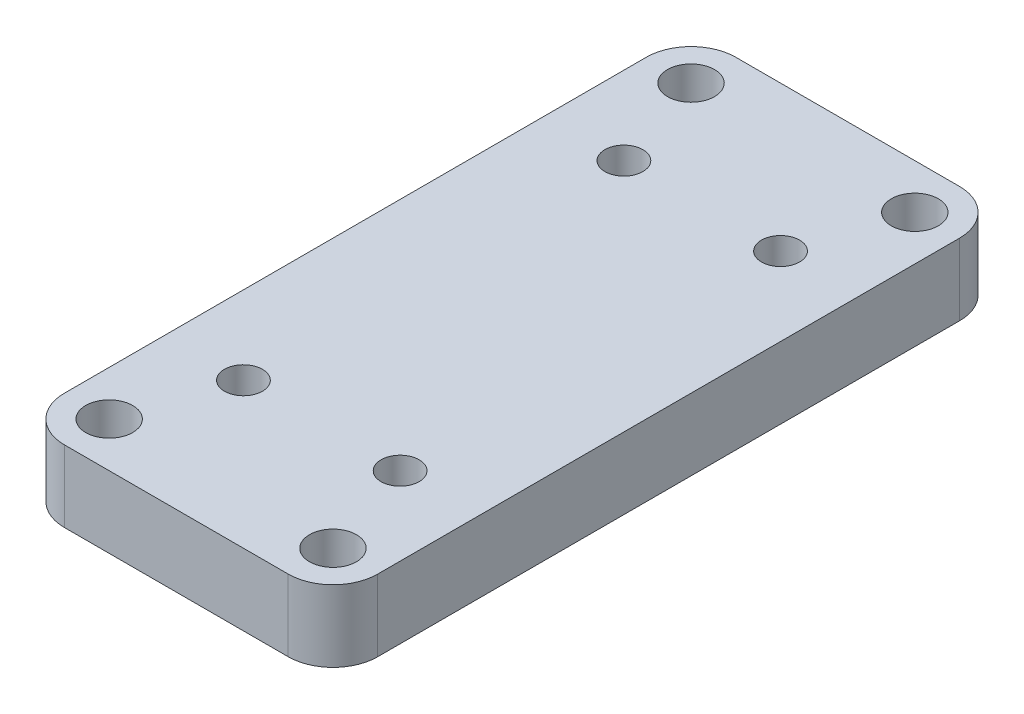
ISO-10303-21;
HEADER;
FILE_DESCRIPTION(('STEP AP214'),'2;1');
FILE_NAME('part.step','',(''),(''),'','','');
FILE_SCHEMA(('AUTOMOTIVE_DESIGN { 1 0 10303 214 1 1 1 1 }'));
ENDSEC;
DATA;
#1=APPLICATION_CONTEXT('core data for automotive mechanical design processes');
#2=APPLICATION_PROTOCOL_DEFINITION('international standard','automotive_design',2000,#1);
#3=PRODUCT_CONTEXT('',#1,'mechanical');
#4=PRODUCT('Part','Part','',(#3));
#5=PRODUCT_RELATED_PRODUCT_CATEGORY('part','',(#4));
#6=PRODUCT_DEFINITION_FORMATION('','',#4);
#7=PRODUCT_DEFINITION_CONTEXT('part definition',#1,'design');
#8=PRODUCT_DEFINITION('design','',#6,#7);
#9=PRODUCT_DEFINITION_SHAPE('','',#8);
#10=(LENGTH_UNIT() NAMED_UNIT(*) SI_UNIT(.MILLI.,.METRE.));
#11=(NAMED_UNIT(*) PLANE_ANGLE_UNIT() SI_UNIT($,.RADIAN.));
#12=(NAMED_UNIT(*) SI_UNIT($,.STERADIAN.) SOLID_ANGLE_UNIT());
#13=UNCERTAINTY_MEASURE_WITH_UNIT(LENGTH_MEASURE(1.E-05),#10,'distance_accuracy_value','');
#14=(GEOMETRIC_REPRESENTATION_CONTEXT(3) GLOBAL_UNCERTAINTY_ASSIGNED_CONTEXT((#13)) GLOBAL_UNIT_ASSIGNED_CONTEXT((#10,
#11,#12)) REPRESENTATION_CONTEXT('',''));
#15=CARTESIAN_POINT('',(0.,0.,0.));
#16=DIRECTION('',(0.,0.,1.));
#17=DIRECTION('',(1.,0.,0.));
#18=AXIS2_PLACEMENT_3D('',#15,#16,#17);
#19=CARTESIAN_POINT('',(-35.,0.,75.));
#20=DIRECTION('',(0.,1.,0.));
#21=DIRECTION('',(1.,0.,0.));
#22=AXIS2_PLACEMENT_3D('',#19,#20,#21);
#23=PLANE('',#22);
#24=CARTESIAN_POINT('',(-52.5,0.,117.5));
#25=DIRECTION('',(0.,1.,0.));
#26=DIRECTION('',(1.,0.,0.));
#27=AXIS2_PLACEMENT_3D('',#24,#25,#26);
#28=CIRCLE('',#27,4.25);
#29=CARTESIAN_POINT('',(-56.75,0.,117.5));
#30=VERTEX_POINT('',#29);
#31=EDGE_CURVE('E189',#30,#30,#28,.T.);
#32=ORIENTED_EDGE('',*,*,#31,.T.);
#33=EDGE_LOOP('',(#32));
#34=FACE_BOUND('',#33,.T.);
#35=CARTESIAN_POINT('',(-52.5,0.,32.5));
#36=DIRECTION('',(0.,1.,0.));
#37=DIRECTION('',(1.,0.,0.));
#38=AXIS2_PLACEMENT_3D('',#35,#36,#37);
#39=CIRCLE('',#38,4.25);
#40=CARTESIAN_POINT('',(-56.75,0.,32.5));
#41=VERTEX_POINT('',#40);
#42=EDGE_CURVE('E229',#41,#41,#39,.T.);
#43=ORIENTED_EDGE('',*,*,#42,.T.);
#44=EDGE_LOOP('',(#43));
#45=FACE_BOUND('',#44,.T.);
#46=CARTESIAN_POINT('',(-17.5,0.,32.5));
#47=DIRECTION('',(0.,1.,0.));
#48=DIRECTION('',(1.,0.,0.));
#49=AXIS2_PLACEMENT_3D('',#46,#47,#48);
#50=CIRCLE('',#49,4.25);
#51=CARTESIAN_POINT('',(-21.75,0.,32.5));
#52=VERTEX_POINT('',#51);
#53=EDGE_CURVE('E213',#52,#52,#50,.T.);
#54=ORIENTED_EDGE('',*,*,#53,.T.);
#55=EDGE_LOOP('',(#54));
#56=FACE_BOUND('',#55,.T.);
#57=CARTESIAN_POINT('',(-17.5,0.,117.5));
#58=DIRECTION('',(0.,1.,0.));
#59=DIRECTION('',(1.,0.,0.));
#60=AXIS2_PLACEMENT_3D('',#57,#58,#59);
#61=CIRCLE('',#60,4.25);
#62=CARTESIAN_POINT('',(-21.75,0.,117.5));
#63=VERTEX_POINT('',#62);
#64=EDGE_CURVE('E214',#63,#63,#61,.T.);
#65=ORIENTED_EDGE('',*,*,#64,.T.);
#66=EDGE_LOOP('',(#65));
#67=FACE_BOUND('',#66,.T.);
#68=CARTESIAN_POINT('',(-10.,0.,140.));
#69=DIRECTION('',(0.,1.,0.));
#70=DIRECTION('',(1.,0.,0.));
#71=AXIS2_PLACEMENT_3D('',#68,#69,#70);
#72=CIRCLE('',#71,5.25);
#73=CARTESIAN_POINT('',(-15.25,0.,140.));
#74=VERTEX_POINT('',#73);
#75=EDGE_CURVE('E218',#74,#74,#72,.T.);
#76=ORIENTED_EDGE('',*,*,#75,.T.);
#77=EDGE_LOOP('',(#76));
#78=FACE_BOUND('',#77,.T.);
#79=CARTESIAN_POINT('',(-10.,0.,10.));
#80=DIRECTION('',(0.,1.,0.));
#81=DIRECTION('',(1.,0.,0.));
#82=AXIS2_PLACEMENT_3D('',#79,#80,#81);
#83=CIRCLE('',#82,5.25);
#84=CARTESIAN_POINT('',(-15.25,0.,10.));
#85=VERTEX_POINT('',#84);
#86=EDGE_CURVE('E20',#85,#85,#83,.T.);
#87=ORIENTED_EDGE('',*,*,#86,.T.);
#88=EDGE_LOOP('',(#87));
#89=FACE_BOUND('',#88,.T.);
#90=CARTESIAN_POINT('',(-60.,0.,10.));
#91=DIRECTION('',(0.,1.,0.));
#92=DIRECTION('',(1.,0.,0.));
#93=AXIS2_PLACEMENT_3D('',#90,#91,#92);
#94=CIRCLE('',#93,5.25);
#95=CARTESIAN_POINT('',(-65.25,0.,10.));
#96=VERTEX_POINT('',#95);
#97=EDGE_CURVE('E162',#96,#96,#94,.T.);
#98=ORIENTED_EDGE('',*,*,#97,.T.);
#99=EDGE_LOOP('',(#98));
#100=FACE_BOUND('',#99,.T.);
#101=CARTESIAN_POINT('',(-60.,0.,140.));
#102=DIRECTION('',(0.,1.,0.));
#103=DIRECTION('',(1.,0.,0.));
#104=AXIS2_PLACEMENT_3D('',#101,#102,#103);
#105=CIRCLE('',#104,5.25);
#106=CARTESIAN_POINT('',(-65.25,0.,140.));
#107=VERTEX_POINT('',#106);
#108=EDGE_CURVE('E158',#107,#107,#105,.T.);
#109=ORIENTED_EDGE('',*,*,#108,.T.);
#110=EDGE_LOOP('',(#109));
#111=FACE_BOUND('',#110,.T.);
#112=CARTESIAN_POINT('',(-10.,0.,140.));
#113=DIRECTION('',(0.,1.,0.));
#114=DIRECTION('',(0.707106781186548,0.,0.707106781186547));
#115=AXIS2_PLACEMENT_3D('',#112,#113,#114);
#116=CIRCLE('',#115,10.);
#117=CARTESIAN_POINT('',(-10.,0.,150.));
#118=VERTEX_POINT('',#117);
#119=CARTESIAN_POINT('',(0.,0.,140.));
#120=VERTEX_POINT('',#119);
#121=EDGE_CURVE('E197',#118,#120,#116,.T.);
#122=ORIENTED_EDGE('',*,*,#121,.F.);
#123=DIRECTION('',(1.,0.,0.));
#124=VECTOR('',#123,1.);
#125=CARTESIAN_POINT('',(-70.,0.,150.));
#126=LINE('',#125,#124);
#127=CARTESIAN_POINT('',(-60.,0.,150.));
#128=VERTEX_POINT('',#127);
#129=EDGE_CURVE('E267',#128,#118,#126,.T.);
#130=ORIENTED_EDGE('',*,*,#129,.F.);
#131=CARTESIAN_POINT('',(-60.,0.,140.));
#132=DIRECTION('',(0.,1.,0.));
#133=DIRECTION('',(-0.707106781186548,0.,0.707106781186548));
#134=AXIS2_PLACEMENT_3D('',#131,#132,#133);
#135=CIRCLE('',#134,10.);
#136=CARTESIAN_POINT('',(-70.,0.,140.));
#137=VERTEX_POINT('',#136);
#138=EDGE_CURVE('E253',#137,#128,#135,.T.);
#139=ORIENTED_EDGE('',*,*,#138,.F.);
#140=DIRECTION('',(0.,0.,1.));
#141=VECTOR('',#140,1.);
#142=CARTESIAN_POINT('',(-70.,0.,0.));
#143=LINE('',#142,#141);
#144=CARTESIAN_POINT('',(-70.,0.,10.));
#145=VERTEX_POINT('',#144);
#146=EDGE_CURVE('E252',#145,#137,#143,.T.);
#147=ORIENTED_EDGE('',*,*,#146,.F.);
#148=CARTESIAN_POINT('',(-60.,0.,10.));
#149=DIRECTION('',(0.,1.,0.));
#150=DIRECTION('',(-0.707106781186548,0.,-0.707106781186548));
#151=AXIS2_PLACEMENT_3D('',#148,#149,#150);
#152=CIRCLE('',#151,10.);
#153=CARTESIAN_POINT('',(-60.,0.,0.));
#154=VERTEX_POINT('',#153);
#155=EDGE_CURVE('E257',#154,#145,#152,.T.);
#156=ORIENTED_EDGE('',*,*,#155,.F.);
#157=DIRECTION('',(-1.,0.,0.));
#158=VECTOR('',#157,1.);
#159=CARTESIAN_POINT('',(0.,0.,0.));
#160=LINE('',#159,#158);
#161=CARTESIAN_POINT('',(-10.,0.,0.));
#162=VERTEX_POINT('',#161);
#163=EDGE_CURVE('E188',#162,#154,#160,.T.);
#164=ORIENTED_EDGE('',*,*,#163,.F.);
#165=CARTESIAN_POINT('',(-10.,0.,10.));
#166=DIRECTION('',(0.,1.,0.));
#167=DIRECTION('',(0.707106781186547,0.,-0.707106781186548));
#168=AXIS2_PLACEMENT_3D('',#165,#166,#167);
#169=CIRCLE('',#168,10.);
#170=CARTESIAN_POINT('',(0.,0.,10.));
#171=VERTEX_POINT('',#170);
#172=EDGE_CURVE('E167',#171,#162,#169,.T.);
#173=ORIENTED_EDGE('',*,*,#172,.F.);
#174=DIRECTION('',(0.,0.,-1.));
#175=VECTOR('',#174,1.);
#176=CARTESIAN_POINT('',(0.,0.,150.));
#177=LINE('',#176,#175);
#178=EDGE_CURVE('E11',#120,#171,#177,.T.);
#179=ORIENTED_EDGE('',*,*,#178,.F.);
#180=EDGE_LOOP('',(#122,#130,#139,#147,#156,#164,#173,#179));
#181=FACE_BOUND('',#180,.T.);
#182=ADVANCED_FACE('F17',(#34,#45,#56,#67,#78,#89,#100,#111,#181),#23,.F.);
#183=CARTESIAN_POINT('',(0.,0.,150.));
#184=DIRECTION('',(1.,0.,0.));
#185=DIRECTION('',(0.,0.,-1.));
#186=AXIS2_PLACEMENT_3D('',#183,#184,#185);
#187=PLANE('',#186);
#188=DIRECTION('',(0.,1.,0.));
#189=VECTOR('',#188,1.);
#190=CARTESIAN_POINT('',(0.,0.,140.));
#191=LINE('',#190,#189);
#192=CARTESIAN_POINT('',(0.,16.,140.));
#193=VERTEX_POINT('',#192);
#194=EDGE_CURVE('E243',#120,#193,#191,.T.);
#195=ORIENTED_EDGE('',*,*,#194,.F.);
#196=ORIENTED_EDGE('',*,*,#178,.T.);
#197=DIRECTION('',(0.,-1.,0.));
#198=VECTOR('',#197,1.);
#199=CARTESIAN_POINT('',(0.,0.,10.));
#200=LINE('',#199,#198);
#201=CARTESIAN_POINT('',(0.,16.,10.));
#202=VERTEX_POINT('',#201);
#203=EDGE_CURVE('E173',#202,#171,#200,.T.);
#204=ORIENTED_EDGE('',*,*,#203,.F.);
#205=DIRECTION('',(0.,0.,-1.));
#206=VECTOR('',#205,1.);
#207=CARTESIAN_POINT('',(0.,16.,150.));
#208=LINE('',#207,#206);
#209=EDGE_CURVE('E262',#193,#202,#208,.T.);
#210=ORIENTED_EDGE('',*,*,#209,.F.);
#211=EDGE_LOOP('',(#195,#196,#204,#210));
#212=FACE_BOUND('',#211,.T.);
#213=ADVANCED_FACE('F356',(#212),#187,.T.);
#214=CARTESIAN_POINT('',(-52.5,0.,117.5));
#215=DIRECTION('',(0.,1.,0.));
#216=DIRECTION('',(1.,0.,0.));
#217=AXIS2_PLACEMENT_3D('',#214,#215,#216);
#218=CYLINDRICAL_SURFACE('',#217,4.25);
#219=ORIENTED_EDGE('',*,*,#31,.F.);
#220=DIRECTION('',(0.,1.,0.));
#221=VECTOR('',#220,1.);
#222=CARTESIAN_POINT('',(-56.75,0.,117.5));
#223=LINE('',#222,#221);
#224=CARTESIAN_POINT('',(-56.75,16.,117.5));
#225=VERTEX_POINT('',#224);
#226=EDGE_CURVE('E27',#30,#225,#223,.T.);
#227=ORIENTED_EDGE('',*,*,#226,.T.);
#228=CARTESIAN_POINT('',(-52.5,16.,117.5));
#229=DIRECTION('',(0.,-1.,0.));
#230=DIRECTION('',(1.,0.,0.));
#231=AXIS2_PLACEMENT_3D('',#228,#229,#230);
#232=CIRCLE('',#231,4.25);
#233=EDGE_CURVE('E207',#225,#225,#232,.T.);
#234=ORIENTED_EDGE('',*,*,#233,.F.);
#235=ORIENTED_EDGE('',*,*,#226,.F.);
#236=EDGE_LOOP('',(#219,#227,#234,#235));
#237=FACE_BOUND('',#236,.T.);
#238=ADVANCED_FACE('F385',(#237),#218,.F.);
#239=CARTESIAN_POINT('',(-52.5,0.,32.5));
#240=DIRECTION('',(0.,1.,0.));
#241=DIRECTION('',(1.,0.,0.));
#242=AXIS2_PLACEMENT_3D('',#239,#240,#241);
#243=CYLINDRICAL_SURFACE('',#242,4.25);
#244=ORIENTED_EDGE('',*,*,#42,.F.);
#245=DIRECTION('',(0.,1.,0.));
#246=VECTOR('',#245,1.);
#247=CARTESIAN_POINT('',(-56.75,0.,32.5));
#248=LINE('',#247,#246);
#249=CARTESIAN_POINT('',(-56.75,16.,32.5));
#250=VERTEX_POINT('',#249);
#251=EDGE_CURVE('E192',#41,#250,#248,.T.);
#252=ORIENTED_EDGE('',*,*,#251,.T.);
#253=CARTESIAN_POINT('',(-52.5,16.,32.5));
#254=DIRECTION('',(0.,-1.,0.));
#255=DIRECTION('',(1.,0.,0.));
#256=AXIS2_PLACEMENT_3D('',#253,#254,#255);
#257=CIRCLE('',#256,4.25);
#258=EDGE_CURVE('E203',#250,#250,#257,.T.);
#259=ORIENTED_EDGE('',*,*,#258,.F.);
#260=ORIENTED_EDGE('',*,*,#251,.F.);
#261=EDGE_LOOP('',(#244,#252,#259,#260));
#262=FACE_BOUND('',#261,.T.);
#263=ADVANCED_FACE('F684',(#262),#243,.F.);
#264=CARTESIAN_POINT('',(-17.5,0.,32.5));
#265=DIRECTION('',(0.,1.,0.));
#266=DIRECTION('',(1.,0.,0.));
#267=AXIS2_PLACEMENT_3D('',#264,#265,#266);
#268=CYLINDRICAL_SURFACE('',#267,4.25);
#269=ORIENTED_EDGE('',*,*,#53,.F.);
#270=DIRECTION('',(0.,1.,0.));
#271=VECTOR('',#270,1.);
#272=CARTESIAN_POINT('',(-21.75,0.,32.5));
#273=LINE('',#272,#271);
#274=CARTESIAN_POINT('',(-21.75,16.,32.5));
#275=VERTEX_POINT('',#274);
#276=EDGE_CURVE('E233',#52,#275,#273,.T.);
#277=ORIENTED_EDGE('',*,*,#276,.T.);
#278=CARTESIAN_POINT('',(-17.5,16.,32.5));
#279=DIRECTION('',(0.,-1.,0.));
#280=DIRECTION('',(1.,0.,0.));
#281=AXIS2_PLACEMENT_3D('',#278,#279,#280);
#282=CIRCLE('',#281,4.25);
#283=EDGE_CURVE('E208',#275,#275,#282,.T.);
#284=ORIENTED_EDGE('',*,*,#283,.F.);
#285=ORIENTED_EDGE('',*,*,#276,.F.);
#286=EDGE_LOOP('',(#269,#277,#284,#285));
#287=FACE_BOUND('',#286,.T.);
#288=ADVANCED_FACE('F422',(#287),#268,.F.);
#289=CARTESIAN_POINT('',(-17.5,0.,117.5));
#290=DIRECTION('',(0.,1.,0.));
#291=DIRECTION('',(1.,0.,0.));
#292=AXIS2_PLACEMENT_3D('',#289,#290,#291);
#293=CYLINDRICAL_SURFACE('',#292,4.25);
#294=ORIENTED_EDGE('',*,*,#64,.F.);
#295=DIRECTION('',(0.,1.,0.));
#296=VECTOR('',#295,1.);
#297=CARTESIAN_POINT('',(-21.75,0.,117.5));
#298=LINE('',#297,#296);
#299=CARTESIAN_POINT('',(-21.75,16.,117.5));
#300=VERTEX_POINT('',#299);
#301=EDGE_CURVE('E209',#63,#300,#298,.T.);
#302=ORIENTED_EDGE('',*,*,#301,.T.);
#303=CARTESIAN_POINT('',(-17.5,16.,117.5));
#304=DIRECTION('',(0.,-1.,0.));
#305=DIRECTION('',(1.,0.,0.));
#306=AXIS2_PLACEMENT_3D('',#303,#304,#305);
#307=CIRCLE('',#306,4.25);
#308=EDGE_CURVE('E237',#300,#300,#307,.T.);
#309=ORIENTED_EDGE('',*,*,#308,.F.);
#310=ORIENTED_EDGE('',*,*,#301,.F.);
#311=EDGE_LOOP('',(#294,#302,#309,#310));
#312=FACE_BOUND('',#311,.T.);
#313=ADVANCED_FACE('F417',(#312),#293,.F.);
#314=CARTESIAN_POINT('',(-10.,0.,140.));
#315=DIRECTION('',(0.,1.,0.));
#316=DIRECTION('',(1.,0.,0.));
#317=AXIS2_PLACEMENT_3D('',#314,#315,#316);
#318=CYLINDRICAL_SURFACE('',#317,5.25);
#319=ORIENTED_EDGE('',*,*,#75,.F.);
#320=DIRECTION('',(0.,1.,0.));
#321=VECTOR('',#320,1.);
#322=CARTESIAN_POINT('',(-15.25,0.,140.));
#323=LINE('',#322,#321);
#324=CARTESIAN_POINT('',(-15.25,16.,140.));
#325=VERTEX_POINT('',#324);
#326=EDGE_CURVE('E215',#74,#325,#323,.T.);
#327=ORIENTED_EDGE('',*,*,#326,.T.);
#328=CARTESIAN_POINT('',(-10.,16.,140.));
#329=DIRECTION('',(0.,-1.,0.));
#330=DIRECTION('',(1.,0.,0.));
#331=AXIS2_PLACEMENT_3D('',#328,#329,#330);
#332=CIRCLE('',#331,5.25);
#333=EDGE_CURVE('E202',#325,#325,#332,.T.);
#334=ORIENTED_EDGE('',*,*,#333,.F.);
#335=ORIENTED_EDGE('',*,*,#326,.F.);
#336=EDGE_LOOP('',(#319,#327,#334,#335));
#337=FACE_BOUND('',#336,.T.);
#338=ADVANCED_FACE('F411',(#337),#318,.F.);
#339=CARTESIAN_POINT('',(-10.,0.,10.));
#340=DIRECTION('',(0.,1.,0.));
#341=DIRECTION('',(1.,0.,0.));
#342=AXIS2_PLACEMENT_3D('',#339,#340,#341);
#343=CYLINDRICAL_SURFACE('',#342,5.25);
#344=ORIENTED_EDGE('',*,*,#86,.F.);
#345=DIRECTION('',(0.,1.,0.));
#346=VECTOR('',#345,1.);
#347=CARTESIAN_POINT('',(-15.25,0.,10.));
#348=LINE('',#347,#346);
#349=CARTESIAN_POINT('',(-15.25,16.,10.));
#350=VERTEX_POINT('',#349);
#351=EDGE_CURVE('E300',#85,#350,#348,.T.);
#352=ORIENTED_EDGE('',*,*,#351,.T.);
#353=CARTESIAN_POINT('',(-10.,16.,10.));
#354=DIRECTION('',(0.,-1.,0.));
#355=DIRECTION('',(1.,0.,0.));
#356=AXIS2_PLACEMENT_3D('',#353,#354,#355);
#357=CIRCLE('',#356,5.25);
#358=EDGE_CURVE('E181',#350,#350,#357,.T.);
#359=ORIENTED_EDGE('',*,*,#358,.F.);
#360=ORIENTED_EDGE('',*,*,#351,.F.);
#361=EDGE_LOOP('',(#344,#352,#359,#360));
#362=FACE_BOUND('',#361,.T.);
#363=ADVANCED_FACE('F405',(#362),#343,.F.);
#364=CARTESIAN_POINT('',(-60.,0.,10.));
#365=DIRECTION('',(0.,1.,0.));
#366=DIRECTION('',(1.,0.,0.));
#367=AXIS2_PLACEMENT_3D('',#364,#365,#366);
#368=CYLINDRICAL_SURFACE('',#367,5.25);
#369=ORIENTED_EDGE('',*,*,#97,.F.);
#370=DIRECTION('',(0.,1.,0.));
#371=VECTOR('',#370,1.);
#372=CARTESIAN_POINT('',(-65.25,0.,10.));
#373=LINE('',#372,#371);
#374=CARTESIAN_POINT('',(-65.25,16.,10.));
#375=VERTEX_POINT('',#374);
#376=EDGE_CURVE('E182',#96,#375,#373,.T.);
#377=ORIENTED_EDGE('',*,*,#376,.T.);
#378=CARTESIAN_POINT('',(-60.,16.,10.));
#379=DIRECTION('',(0.,-1.,0.));
#380=DIRECTION('',(1.,0.,0.));
#381=AXIS2_PLACEMENT_3D('',#378,#379,#380);
#382=CIRCLE('',#381,5.25);
#383=EDGE_CURVE('E177',#375,#375,#382,.T.);
#384=ORIENTED_EDGE('',*,*,#383,.F.);
#385=ORIENTED_EDGE('',*,*,#376,.F.);
#386=EDGE_LOOP('',(#369,#377,#384,#385));
#387=FACE_BOUND('',#386,.T.);
#388=ADVANCED_FACE('F400',(#387),#368,.F.);
#389=CARTESIAN_POINT('',(-60.,0.,140.));
#390=DIRECTION('',(0.,1.,0.));
#391=DIRECTION('',(1.,0.,0.));
#392=AXIS2_PLACEMENT_3D('',#389,#390,#391);
#393=CYLINDRICAL_SURFACE('',#392,5.25);
#394=ORIENTED_EDGE('',*,*,#108,.F.);
#395=DIRECTION('',(0.,1.,0.));
#396=VECTOR('',#395,1.);
#397=CARTESIAN_POINT('',(-65.25,0.,140.));
#398=LINE('',#397,#396);
#399=CARTESIAN_POINT('',(-65.25,16.,140.));
#400=VERTEX_POINT('',#399);
#401=EDGE_CURVE('E155',#107,#400,#398,.T.);
#402=ORIENTED_EDGE('',*,*,#401,.T.);
#403=CARTESIAN_POINT('',(-60.,16.,140.));
#404=DIRECTION('',(0.,-1.,0.));
#405=DIRECTION('',(1.,0.,0.));
#406=AXIS2_PLACEMENT_3D('',#403,#404,#405);
#407=CIRCLE('',#406,5.25);
#408=EDGE_CURVE('E160',#400,#400,#407,.T.);
#409=ORIENTED_EDGE('',*,*,#408,.F.);
#410=ORIENTED_EDGE('',*,*,#401,.F.);
#411=EDGE_LOOP('',(#394,#402,#409,#410));
#412=FACE_BOUND('',#411,.T.);
#413=ADVANCED_FACE('F157',(#412),#393,.F.);
#414=CARTESIAN_POINT('',(-10.,0.,10.));
#415=DIRECTION('',(0.,1.,0.));
#416=DIRECTION('',(0.707106781186547,0.,-0.707106781186548));
#417=AXIS2_PLACEMENT_3D('',#414,#415,#416);
#418=CYLINDRICAL_SURFACE('',#417,10.);
#419=CARTESIAN_POINT('',(-10.,16.,10.));
#420=DIRECTION('',(0.,-1.,0.));
#421=DIRECTION('',(0.707106781186547,0.,-0.707106781186548));
#422=AXIS2_PLACEMENT_3D('',#419,#420,#421);
#423=CIRCLE('',#422,10.);
#424=CARTESIAN_POINT('',(-10.,16.,0.));
#425=VERTEX_POINT('',#424);
#426=EDGE_CURVE('E266',#425,#202,#423,.T.);
#427=ORIENTED_EDGE('',*,*,#426,.T.);
#428=ORIENTED_EDGE('',*,*,#203,.T.);
#429=ORIENTED_EDGE('',*,*,#172,.T.);
#430=DIRECTION('',(0.,1.,0.));
#431=VECTOR('',#430,1.);
#432=CARTESIAN_POINT('',(-10.,0.,0.));
#433=LINE('',#432,#431);
#434=EDGE_CURVE('E260',#162,#425,#433,.T.);
#435=ORIENTED_EDGE('',*,*,#434,.T.);
#436=EDGE_LOOP('',(#427,#428,#429,#435));
#437=FACE_BOUND('',#436,.T.);
#438=ADVANCED_FACE('F357',(#437),#418,.T.);
#439=CARTESIAN_POINT('',(0.,0.,0.));
#440=DIRECTION('',(0.,0.,-1.));
#441=DIRECTION('',(-1.,0.,0.));
#442=AXIS2_PLACEMENT_3D('',#439,#440,#441);
#443=PLANE('',#442);
#444=DIRECTION('',(0.,-1.,0.));
#445=VECTOR('',#444,1.);
#446=CARTESIAN_POINT('',(-60.,0.,0.));
#447=LINE('',#446,#445);
#448=CARTESIAN_POINT('',(-60.,16.,0.));
#449=VERTEX_POINT('',#448);
#450=EDGE_CURVE('E261',#449,#154,#447,.T.);
#451=ORIENTED_EDGE('',*,*,#450,.F.);
#452=DIRECTION('',(-1.,0.,0.));
#453=VECTOR('',#452,1.);
#454=CARTESIAN_POINT('',(0.,16.,0.));
#455=LINE('',#454,#453);
#456=EDGE_CURVE('E224',#425,#449,#455,.T.);
#457=ORIENTED_EDGE('',*,*,#456,.F.);
#458=ORIENTED_EDGE('',*,*,#434,.F.);
#459=ORIENTED_EDGE('',*,*,#163,.T.);
#460=EDGE_LOOP('',(#451,#457,#458,#459));
#461=FACE_BOUND('',#460,.T.);
#462=ADVANCED_FACE('F359',(#461),#443,.T.);
#463=CARTESIAN_POINT('',(-60.,0.,10.));
#464=DIRECTION('',(0.,1.,0.));
#465=DIRECTION('',(-0.707106781186548,0.,-0.707106781186548));
#466=AXIS2_PLACEMENT_3D('',#463,#464,#465);
#467=CYLINDRICAL_SURFACE('',#466,10.);
#468=CARTESIAN_POINT('',(-60.,16.,10.));
#469=DIRECTION('',(0.,-1.,0.));
#470=DIRECTION('',(-0.707106781186548,0.,-0.707106781186548));
#471=AXIS2_PLACEMENT_3D('',#468,#469,#470);
#472=CIRCLE('',#471,10.);
#473=CARTESIAN_POINT('',(-70.,16.,10.));
#474=VERTEX_POINT('',#473);
#475=EDGE_CURVE('E219',#474,#449,#472,.T.);
#476=ORIENTED_EDGE('',*,*,#475,.T.);
#477=ORIENTED_EDGE('',*,*,#450,.T.);
#478=ORIENTED_EDGE('',*,*,#155,.T.);
#479=DIRECTION('',(0.,1.,0.));
#480=VECTOR('',#479,1.);
#481=CARTESIAN_POINT('',(-70.,0.,10.));
#482=LINE('',#481,#480);
#483=EDGE_CURVE('E249',#145,#474,#482,.T.);
#484=ORIENTED_EDGE('',*,*,#483,.T.);
#485=EDGE_LOOP('',(#476,#477,#478,#484));
#486=FACE_BOUND('',#485,.T.);
#487=ADVANCED_FACE('F361',(#486),#467,.T.);
#488=CARTESIAN_POINT('',(-70.,0.,0.));
#489=DIRECTION('',(-1.,0.,0.));
#490=DIRECTION('',(0.,0.,1.));
#491=AXIS2_PLACEMENT_3D('',#488,#489,#490);
#492=PLANE('',#491);
#493=DIRECTION('',(0.,-1.,0.));
#494=VECTOR('',#493,1.);
#495=CARTESIAN_POINT('',(-70.,0.,140.));
#496=LINE('',#495,#494);
#497=CARTESIAN_POINT('',(-70.,16.,140.));
#498=VERTEX_POINT('',#497);
#499=EDGE_CURVE('E228',#498,#137,#496,.T.);
#500=ORIENTED_EDGE('',*,*,#499,.F.);
#501=DIRECTION('',(0.,0.,1.));
#502=VECTOR('',#501,1.);
#503=CARTESIAN_POINT('',(-70.,16.,0.));
#504=LINE('',#503,#502);
#505=EDGE_CURVE('E223',#474,#498,#504,.T.);
#506=ORIENTED_EDGE('',*,*,#505,.F.);
#507=ORIENTED_EDGE('',*,*,#483,.F.);
#508=ORIENTED_EDGE('',*,*,#146,.T.);
#509=EDGE_LOOP('',(#500,#506,#507,#508));
#510=FACE_BOUND('',#509,.T.);
#511=ADVANCED_FACE('F366',(#510),#492,.T.);
#512=CARTESIAN_POINT('',(-60.,0.,140.));
#513=DIRECTION('',(0.,1.,0.));
#514=DIRECTION('',(-0.707106781186548,0.,0.707106781186548));
#515=AXIS2_PLACEMENT_3D('',#512,#513,#514);
#516=CYLINDRICAL_SURFACE('',#515,10.);
#517=CARTESIAN_POINT('',(-60.,16.,140.));
#518=DIRECTION('',(0.,-1.,0.));
#519=DIRECTION('',(-0.707106781186548,0.,0.707106781186548));
#520=AXIS2_PLACEMENT_3D('',#517,#518,#519);
#521=CIRCLE('',#520,10.);
#522=CARTESIAN_POINT('',(-60.,16.,150.));
#523=VERTEX_POINT('',#522);
#524=EDGE_CURVE('E248',#523,#498,#521,.T.);
#525=ORIENTED_EDGE('',*,*,#524,.T.);
#526=ORIENTED_EDGE('',*,*,#499,.T.);
#527=ORIENTED_EDGE('',*,*,#138,.T.);
#528=DIRECTION('',(0.,1.,0.));
#529=VECTOR('',#528,1.);
#530=CARTESIAN_POINT('',(-60.,0.,150.));
#531=LINE('',#530,#529);
#532=EDGE_CURVE('E242',#128,#523,#531,.T.);
#533=ORIENTED_EDGE('',*,*,#532,.T.);
#534=EDGE_LOOP('',(#525,#526,#527,#533));
#535=FACE_BOUND('',#534,.T.);
#536=ADVANCED_FACE('F368',(#535),#516,.T.);
#537=CARTESIAN_POINT('',(-35.,16.,75.));
#538=DIRECTION('',(0.,1.,0.));
#539=DIRECTION('',(1.,0.,0.));
#540=AXIS2_PLACEMENT_3D('',#537,#538,#539);
#541=PLANE('',#540);
#542=ORIENTED_EDGE('',*,*,#233,.T.);
#543=EDGE_LOOP('',(#542));
#544=FACE_BOUND('',#543,.T.);
#545=ORIENTED_EDGE('',*,*,#258,.T.);
#546=EDGE_LOOP('',(#545));
#547=FACE_BOUND('',#546,.T.);
#548=ORIENTED_EDGE('',*,*,#283,.T.);
#549=EDGE_LOOP('',(#548));
#550=FACE_BOUND('',#549,.T.);
#551=ORIENTED_EDGE('',*,*,#308,.T.);
#552=EDGE_LOOP('',(#551));
#553=FACE_BOUND('',#552,.T.);
#554=ORIENTED_EDGE('',*,*,#333,.T.);
#555=EDGE_LOOP('',(#554));
#556=FACE_BOUND('',#555,.T.);
#557=ORIENTED_EDGE('',*,*,#358,.T.);
#558=EDGE_LOOP('',(#557));
#559=FACE_BOUND('',#558,.T.);
#560=ORIENTED_EDGE('',*,*,#383,.T.);
#561=EDGE_LOOP('',(#560));
#562=FACE_BOUND('',#561,.T.);
#563=ORIENTED_EDGE('',*,*,#408,.T.);
#564=EDGE_LOOP('',(#563));
#565=FACE_BOUND('',#564,.T.);
#566=CARTESIAN_POINT('',(-10.,16.,140.));
#567=DIRECTION('',(0.,-1.,0.));
#568=DIRECTION('',(0.707106781186548,0.,0.707106781186547));
#569=AXIS2_PLACEMENT_3D('',#566,#567,#568);
#570=CIRCLE('',#569,10.);
#571=CARTESIAN_POINT('',(-10.,16.,150.));
#572=VERTEX_POINT('',#571);
#573=EDGE_CURVE('E198',#193,#572,#570,.T.);
#574=ORIENTED_EDGE('',*,*,#573,.F.);
#575=ORIENTED_EDGE('',*,*,#209,.T.);
#576=ORIENTED_EDGE('',*,*,#426,.F.);
#577=ORIENTED_EDGE('',*,*,#456,.T.);
#578=ORIENTED_EDGE('',*,*,#475,.F.);
#579=ORIENTED_EDGE('',*,*,#505,.T.);
#580=ORIENTED_EDGE('',*,*,#524,.F.);
#581=DIRECTION('',(1.,0.,0.));
#582=VECTOR('',#581,1.);
#583=CARTESIAN_POINT('',(-70.,16.,150.));
#584=LINE('',#583,#582);
#585=EDGE_CURVE('E240',#523,#572,#584,.T.);
#586=ORIENTED_EDGE('',*,*,#585,.T.);
#587=EDGE_LOOP('',(#574,#575,#576,#577,#578,#579,#580,#586));
#588=FACE_BOUND('',#587,.T.);
#589=ADVANCED_FACE('F346',(#544,#547,#550,#553,#556,#559,#562,#565,#588),#541,.T.);
#590=CARTESIAN_POINT('',(-70.,0.,150.));
#591=DIRECTION('',(0.,0.,1.));
#592=DIRECTION('',(1.,0.,0.));
#593=AXIS2_PLACEMENT_3D('',#590,#591,#592);
#594=PLANE('',#593);
#595=DIRECTION('',(0.,-1.,0.));
#596=VECTOR('',#595,1.);
#597=CARTESIAN_POINT('',(-10.,0.,150.));
#598=LINE('',#597,#596);
#599=EDGE_CURVE('E193',#572,#118,#598,.T.);
#600=ORIENTED_EDGE('',*,*,#599,.F.);
#601=ORIENTED_EDGE('',*,*,#585,.F.);
#602=ORIENTED_EDGE('',*,*,#532,.F.);
#603=ORIENTED_EDGE('',*,*,#129,.T.);
#604=EDGE_LOOP('',(#600,#601,#602,#603));
#605=FACE_BOUND('',#604,.T.);
#606=ADVANCED_FACE('F352',(#605),#594,.T.);
#607=CARTESIAN_POINT('',(-10.,0.,140.));
#608=DIRECTION('',(0.,1.,0.));
#609=DIRECTION('',(0.707106781186548,0.,0.707106781186547));
#610=AXIS2_PLACEMENT_3D('',#607,#608,#609);
#611=CYLINDRICAL_SURFACE('',#610,10.);
#612=ORIENTED_EDGE('',*,*,#573,.T.);
#613=ORIENTED_EDGE('',*,*,#599,.T.);
#614=ORIENTED_EDGE('',*,*,#121,.T.);
#615=ORIENTED_EDGE('',*,*,#194,.T.);
#616=EDGE_LOOP('',(#612,#613,#614,#615));
#617=FACE_BOUND('',#616,.T.);
#618=ADVANCED_FACE('F342',(#617),#611,.T.);
#619=CLOSED_SHELL('',(#182,#213,#238,#263,#288,#313,#338,#363,#388,#413,#438,#462,#487,#511,
#536,#589,#606,#618));
#620=MANIFOLD_SOLID_BREP('B1',#619);
#621=ADVANCED_BREP_SHAPE_REPRESENTATION('',(#18,#620),#14);
#622=SHAPE_DEFINITION_REPRESENTATION(#9,#621);
ENDSEC;
END-ISO-10303-21;
